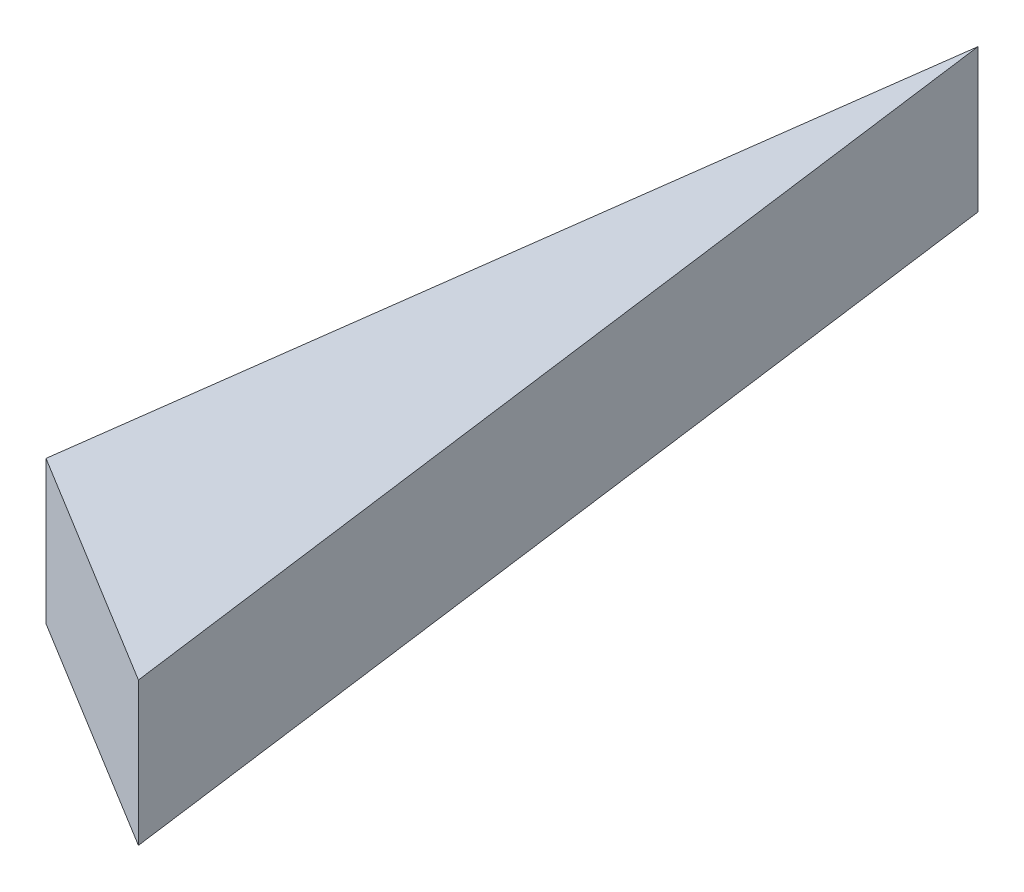
ISO-10303-21;
HEADER;
FILE_DESCRIPTION(('STEP AP214'),'2;1');
FILE_NAME('part.step','',(''),(''),'','','');
FILE_SCHEMA(('AUTOMOTIVE_DESIGN { 1 0 10303 214 1 1 1 1 }'));
ENDSEC;
DATA;
#1=APPLICATION_CONTEXT('core data for automotive mechanical design processes');
#2=APPLICATION_PROTOCOL_DEFINITION('international standard','automotive_design',2000,#1);
#3=PRODUCT_CONTEXT('',#1,'mechanical');
#4=PRODUCT('Part','Part','',(#3));
#5=PRODUCT_RELATED_PRODUCT_CATEGORY('part','',(#4));
#6=PRODUCT_DEFINITION_FORMATION('','',#4);
#7=PRODUCT_DEFINITION_CONTEXT('part definition',#1,'design');
#8=PRODUCT_DEFINITION('design','',#6,#7);
#9=PRODUCT_DEFINITION_SHAPE('','',#8);
#10=(LENGTH_UNIT() NAMED_UNIT(*) SI_UNIT(.MILLI.,.METRE.));
#11=(NAMED_UNIT(*) PLANE_ANGLE_UNIT() SI_UNIT($,.RADIAN.));
#12=(NAMED_UNIT(*) SI_UNIT($,.STERADIAN.) SOLID_ANGLE_UNIT());
#13=UNCERTAINTY_MEASURE_WITH_UNIT(LENGTH_MEASURE(1.E-05),#10,'distance_accuracy_value','');
#14=(GEOMETRIC_REPRESENTATION_CONTEXT(3) GLOBAL_UNCERTAINTY_ASSIGNED_CONTEXT((#13)) GLOBAL_UNIT_ASSIGNED_CONTEXT((#10,
#11,#12)) REPRESENTATION_CONTEXT('',''));
#15=CARTESIAN_POINT('',(0.,0.,0.));
#16=DIRECTION('',(0.,0.,1.));
#17=DIRECTION('',(1.,0.,0.));
#18=AXIS2_PLACEMENT_3D('',#15,#16,#17);
#19=CARTESIAN_POINT('',(0.,-65.09,0.));
#20=DIRECTION('',(0.,-1.,0.));
#21=DIRECTION('',(0.,0.,-1.));
#22=AXIS2_PLACEMENT_3D('',#19,#20,#21);
#23=PLANE('',#22);
#24=DIRECTION('',(-0.13182166265006,0.,-0.991273448275588));
#25=VECTOR('',#24,1.);
#26=CARTESIAN_POINT('',(117.055,-65.09,880.230996599756));
#27=LINE('',#26,#25);
#28=CARTESIAN_POINT('',(117.055,-65.09,880.230996599756));
#29=VERTEX_POINT('',#28);
#30=CARTESIAN_POINT('',(0.,-65.09,0.));
#31=VERTEX_POINT('',#30);
#32=EDGE_CURVE('E116',#29,#31,#27,.T.);
#33=ORIENTED_EDGE('',*,*,#32,.F.);
#34=DIRECTION('',(0.8529796538446,0.,0.52194416380217));
#35=VECTOR('',#34,1.);
#36=CARTESIAN_POINT('',(-99.4383530034461,-65.09,747.757212972207));
#37=LINE('',#36,#35);
#38=CARTESIAN_POINT('',(-99.4383530034461,-65.09,747.757212972207));
#39=VERTEX_POINT('',#38);
#40=EDGE_CURVE('E74',#39,#29,#37,.T.);
#41=ORIENTED_EDGE('',*,*,#40,.F.);
#42=DIRECTION('',(-0.13182166265006,0.,0.991273448275587));
#43=VECTOR('',#42,1.);
#44=CARTESIAN_POINT('',(0.,-65.09,0.));
#45=LINE('',#44,#43);
#46=EDGE_CURVE('E120',#31,#39,#45,.T.);
#47=ORIENTED_EDGE('',*,*,#46,.F.);
#48=EDGE_LOOP('',(#33,#41,#47));
#49=FACE_BOUND('',#48,.T.);
#50=DIRECTION('',(0.8529796538446,0.,0.52194416380217));
#51=VECTOR('',#50,1.);
#52=CARTESIAN_POINT('',(-357.387151065233,-65.09,584.054750576106));
#53=LINE('',#52,#51);
#54=CARTESIAN_POINT('',(-94.0530383790739,-65.09,745.190719795372));
#55=VERTEX_POINT('',#54);
#56=CARTESIAN_POINT('',(110.715615000994,-65.09,870.490078437317));
#57=VERTEX_POINT('',#56);
#58=EDGE_CURVE('E48',#55,#57,#53,.T.);
#59=ORIENTED_EDGE('',*,*,#58,.T.);
#60=DIRECTION('',(-0.13182166265006,0.,-0.991273448275588));
#61=VECTOR('',#60,1.);
#62=CARTESIAN_POINT('',(-4.95636724137794,-65.09,0.659108313250299));
#63=LINE('',#62,#61);
#64=CARTESIAN_POINT('',(0.,-65.09,37.9300328905216));
#65=VERTEX_POINT('',#64);
#66=EDGE_CURVE('E126',#57,#65,#63,.T.);
#67=ORIENTED_EDGE('',*,*,#66,.T.);
#68=DIRECTION('',(-0.13182166265006,0.,0.991273448275588));
#69=VECTOR('',#68,1.);
#70=CARTESIAN_POINT('',(4.95636724137794,-65.09,0.659108313250299));
#71=LINE('',#70,#69);
#72=EDGE_CURVE('E115',#65,#55,#71,.T.);
#73=ORIENTED_EDGE('',*,*,#72,.T.);
#74=EDGE_LOOP('',(#59,#67,#73));
#75=FACE_BOUND('',#74,.T.);
#76=ADVANCED_FACE('F33',(#49,#75),#23,.T.);
#77=CARTESIAN_POINT('',(117.055,65.09,880.230996599756));
#78=DIRECTION('',(-0.991273448275587,0.,0.13182166265006));
#79=DIRECTION('',(0.13182166265006,0.,0.991273448275587));
#80=AXIS2_PLACEMENT_3D('',#77,#78,#79);
#81=PLANE('',#80);
#82=ORIENTED_EDGE('',*,*,#32,.T.);
#83=DIRECTION('',(0.,-1.,0.));
#84=VECTOR('',#83,1.);
#85=CARTESIAN_POINT('',(0.,65.09,0.));
#86=LINE('',#85,#84);
#87=CARTESIAN_POINT('',(0.,65.09,0.));
#88=VERTEX_POINT('',#87);
#89=EDGE_CURVE('E11',#88,#31,#86,.T.);
#90=ORIENTED_EDGE('',*,*,#89,.F.);
#91=DIRECTION('',(-0.13182166265006,0.,-0.991273448275588));
#92=VECTOR('',#91,1.);
#93=CARTESIAN_POINT('',(117.055,65.09,880.230996599756));
#94=LINE('',#93,#92);
#95=CARTESIAN_POINT('',(117.055,65.09,880.230996599756));
#96=VERTEX_POINT('',#95);
#97=EDGE_CURVE('E130',#96,#88,#94,.T.);
#98=ORIENTED_EDGE('',*,*,#97,.F.);
#99=DIRECTION('',(0.,-1.,0.));
#100=VECTOR('',#99,1.);
#101=CARTESIAN_POINT('',(117.055,65.09,880.230996599756));
#102=LINE('',#101,#100);
#103=EDGE_CURVE('E133',#96,#29,#102,.T.);
#104=ORIENTED_EDGE('',*,*,#103,.T.);
#105=EDGE_LOOP('',(#82,#90,#98,#104));
#106=FACE_BOUND('',#105,.T.);
#107=ADVANCED_FACE('F35',(#106),#81,.F.);
#108=CARTESIAN_POINT('',(0.,65.09,0.));
#109=DIRECTION('',(0.991273448275587,0.,0.13182166265006));
#110=DIRECTION('',(0.13182166265006,0.,-0.991273448275587));
#111=AXIS2_PLACEMENT_3D('',#108,#109,#110);
#112=PLANE('',#111);
#113=ORIENTED_EDGE('',*,*,#46,.T.);
#114=DIRECTION('',(0.,-1.,0.));
#115=VECTOR('',#114,1.);
#116=CARTESIAN_POINT('',(-99.4383530034461,65.09,747.757212972207));
#117=LINE('',#116,#115);
#118=CARTESIAN_POINT('',(-99.4383530034461,65.09,747.757212972207));
#119=VERTEX_POINT('',#118);
#120=EDGE_CURVE('E41',#119,#39,#117,.T.);
#121=ORIENTED_EDGE('',*,*,#120,.F.);
#122=DIRECTION('',(-0.13182166265006,0.,0.991273448275587));
#123=VECTOR('',#122,1.);
#124=CARTESIAN_POINT('',(0.,65.09,0.));
#125=LINE('',#124,#123);
#126=EDGE_CURVE('E79',#88,#119,#125,.T.);
#127=ORIENTED_EDGE('',*,*,#126,.F.);
#128=ORIENTED_EDGE('',*,*,#89,.T.);
#129=EDGE_LOOP('',(#113,#121,#127,#128));
#130=FACE_BOUND('',#129,.T.);
#131=ADVANCED_FACE('F152',(#130),#112,.F.);
#132=CARTESIAN_POINT('',(-99.4383530034461,65.09,747.757212972207));
#133=DIRECTION('',(0.52194416380217,0.,-0.8529796538446));
#134=DIRECTION('',(-0.8529796538446,0.,-0.52194416380217));
#135=AXIS2_PLACEMENT_3D('',#132,#133,#134);
#136=PLANE('',#135);
#137=ORIENTED_EDGE('',*,*,#40,.T.);
#138=ORIENTED_EDGE('',*,*,#103,.F.);
#139=DIRECTION('',(0.8529796538446,0.,0.52194416380217));
#140=VECTOR('',#139,1.);
#141=CARTESIAN_POINT('',(-99.4383530034461,65.09,747.757212972207));
#142=LINE('',#141,#140);
#143=EDGE_CURVE('E57',#119,#96,#142,.T.);
#144=ORIENTED_EDGE('',*,*,#143,.F.);
#145=ORIENTED_EDGE('',*,*,#120,.T.);
#146=EDGE_LOOP('',(#137,#138,#144,#145));
#147=FACE_BOUND('',#146,.T.);
#148=ADVANCED_FACE('F137',(#147),#136,.F.);
#149=CARTESIAN_POINT('',(0.,65.09,0.));
#150=DIRECTION('',(0.,-1.,0.));
#151=DIRECTION('',(0.,0.,-1.));
#152=AXIS2_PLACEMENT_3D('',#149,#150,#151);
#153=PLANE('',#152);
#154=ORIENTED_EDGE('',*,*,#97,.T.);
#155=ORIENTED_EDGE('',*,*,#126,.T.);
#156=ORIENTED_EDGE('',*,*,#143,.T.);
#157=EDGE_LOOP('',(#154,#155,#156));
#158=FACE_BOUND('',#157,.T.);
#159=ADVANCED_FACE('F144',(#158),#153,.F.);
#160=CARTESIAN_POINT('',(112.098632758622,65.09,880.890104913006));
#161=DIRECTION('',(-0.991273448275587,0.,0.13182166265006));
#162=DIRECTION('',(0.13182166265006,0.,0.991273448275587));
#163=AXIS2_PLACEMENT_3D('',#160,#161,#162);
#164=PLANE('',#163);
#165=ORIENTED_EDGE('',*,*,#66,.F.);
#166=DIRECTION('',(0.,-1.,0.));
#167=VECTOR('',#166,1.);
#168=CARTESIAN_POINT('',(110.715615000994,65.09,870.490078437317));
#169=LINE('',#168,#167);
#170=CARTESIAN_POINT('',(110.715615000994,60.09,870.490078437317));
#171=VERTEX_POINT('',#170);
#172=EDGE_CURVE('E111',#171,#57,#169,.T.);
#173=ORIENTED_EDGE('',*,*,#172,.F.);
#174=DIRECTION('',(-0.13182166265006,0.,-0.991273448275588));
#175=VECTOR('',#174,1.);
#176=CARTESIAN_POINT('',(-4.95636724137794,60.09,0.659108313250299));
#177=LINE('',#176,#175);
#178=CARTESIAN_POINT('',(0.,60.09,37.9300328905216));
#179=VERTEX_POINT('',#178);
#180=EDGE_CURVE('E99',#171,#179,#177,.T.);
#181=ORIENTED_EDGE('',*,*,#180,.T.);
#182=DIRECTION('',(0.,-1.,0.));
#183=VECTOR('',#182,1.);
#184=CARTESIAN_POINT('',(0.,65.09,37.9300328905216));
#185=LINE('',#184,#183);
#186=EDGE_CURVE('E109',#179,#65,#185,.T.);
#187=ORIENTED_EDGE('',*,*,#186,.T.);
#188=EDGE_LOOP('',(#165,#173,#181,#187));
#189=FACE_BOUND('',#188,.T.);
#190=ADVANCED_FACE('F108',(#189),#164,.T.);
#191=CARTESIAN_POINT('',(4.95636724137794,65.09,0.659108313250299));
#192=DIRECTION('',(0.991273448275587,0.,0.13182166265006));
#193=DIRECTION('',(0.13182166265006,0.,-0.991273448275587));
#194=AXIS2_PLACEMENT_3D('',#191,#192,#193);
#195=PLANE('',#194);
#196=ORIENTED_EDGE('',*,*,#72,.F.);
#197=ORIENTED_EDGE('',*,*,#186,.F.);
#198=DIRECTION('',(-0.13182166265006,0.,0.991273448275588));
#199=VECTOR('',#198,1.);
#200=CARTESIAN_POINT('',(4.95636724137794,60.09,0.659108313250299));
#201=LINE('',#200,#199);
#202=CARTESIAN_POINT('',(-94.0530383790739,60.09,745.190719795372));
#203=VERTEX_POINT('',#202);
#204=EDGE_CURVE('E96',#179,#203,#201,.T.);
#205=ORIENTED_EDGE('',*,*,#204,.T.);
#206=DIRECTION('',(0.,-1.,0.));
#207=VECTOR('',#206,1.);
#208=CARTESIAN_POINT('',(-94.0530383790739,65.09,745.190719795372));
#209=LINE('',#208,#207);
#210=EDGE_CURVE('E117',#203,#55,#209,.T.);
#211=ORIENTED_EDGE('',*,*,#210,.T.);
#212=EDGE_LOOP('',(#196,#197,#205,#211));
#213=FACE_BOUND('',#212,.T.);
#214=ADVANCED_FACE('F113',(#213),#195,.T.);
#215=CARTESIAN_POINT('',(-96.8286321844352,65.09,743.492314702984));
#216=DIRECTION('',(0.52194416380217,0.,-0.8529796538446));
#217=DIRECTION('',(-0.8529796538446,0.,-0.52194416380217));
#218=AXIS2_PLACEMENT_3D('',#215,#216,#217);
#219=PLANE('',#218);
#220=ORIENTED_EDGE('',*,*,#58,.F.);
#221=ORIENTED_EDGE('',*,*,#210,.F.);
#222=DIRECTION('',(0.8529796538446,0.,0.52194416380217));
#223=VECTOR('',#222,1.);
#224=CARTESIAN_POINT('',(-357.387151065233,60.09,584.054750576106));
#225=LINE('',#224,#223);
#226=EDGE_CURVE('E100',#203,#171,#225,.T.);
#227=ORIENTED_EDGE('',*,*,#226,.T.);
#228=ORIENTED_EDGE('',*,*,#172,.T.);
#229=EDGE_LOOP('',(#220,#221,#227,#228));
#230=FACE_BOUND('',#229,.T.);
#231=ADVANCED_FACE('F192',(#230),#219,.T.);
#232=CARTESIAN_POINT('',(0.,60.09,0.));
#233=DIRECTION('',(0.,-1.,0.));
#234=DIRECTION('',(0.,0.,-1.));
#235=AXIS2_PLACEMENT_3D('',#232,#233,#234);
#236=PLANE('',#235);
#237=ORIENTED_EDGE('',*,*,#180,.F.);
#238=ORIENTED_EDGE('',*,*,#226,.F.);
#239=ORIENTED_EDGE('',*,*,#204,.F.);
#240=EDGE_LOOP('',(#237,#238,#239));
#241=FACE_BOUND('',#240,.T.);
#242=ADVANCED_FACE('F98',(#241),#236,.T.);
#243=CLOSED_SHELL('',(#76,#107,#131,#148,#159,#190,#214,#231,#242));
#244=MANIFOLD_SOLID_BREP('B2',#243);
#245=ADVANCED_BREP_SHAPE_REPRESENTATION('',(#18,#244),#14);
#246=SHAPE_DEFINITION_REPRESENTATION(#9,#245);
ENDSEC;
END-ISO-10303-21;
